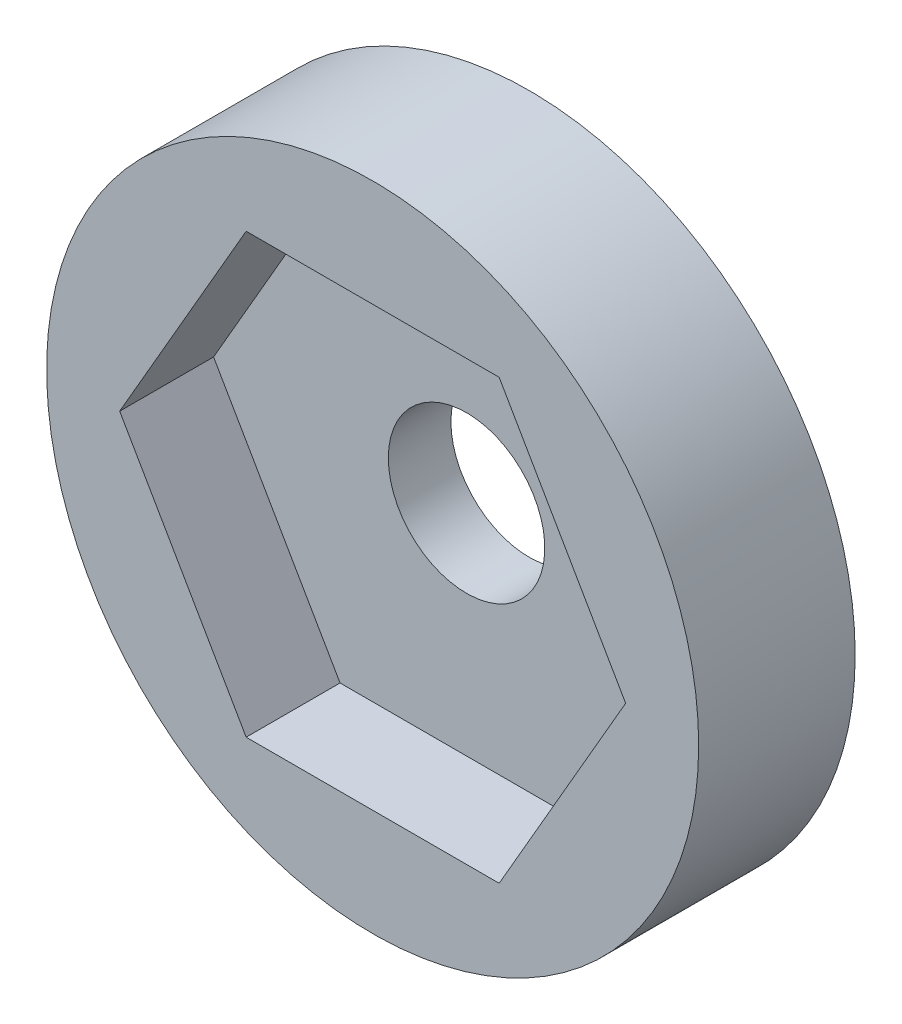
ISO-10303-21;
HEADER;
FILE_DESCRIPTION(('STEP AP214'),'2;1');
FILE_NAME('part.step','',(''),(''),'','','');
FILE_SCHEMA(('AUTOMOTIVE_DESIGN { 1 0 10303 214 1 1 1 1 }'));
ENDSEC;
DATA;
#1=APPLICATION_CONTEXT('core data for automotive mechanical design processes');
#2=APPLICATION_PROTOCOL_DEFINITION('international standard','automotive_design',2000,#1);
#3=PRODUCT_CONTEXT('',#1,'mechanical');
#4=PRODUCT('Part','Part','',(#3));
#5=PRODUCT_RELATED_PRODUCT_CATEGORY('part','',(#4));
#6=PRODUCT_DEFINITION_FORMATION('','',#4);
#7=PRODUCT_DEFINITION_CONTEXT('part definition',#1,'design');
#8=PRODUCT_DEFINITION('design','',#6,#7);
#9=PRODUCT_DEFINITION_SHAPE('','',#8);
#10=(LENGTH_UNIT() NAMED_UNIT(*) SI_UNIT(.MILLI.,.METRE.));
#11=(NAMED_UNIT(*) PLANE_ANGLE_UNIT() SI_UNIT($,.RADIAN.));
#12=(NAMED_UNIT(*) SI_UNIT($,.STERADIAN.) SOLID_ANGLE_UNIT());
#13=UNCERTAINTY_MEASURE_WITH_UNIT(LENGTH_MEASURE(1.E-05),#10,'distance_accuracy_value','');
#14=(GEOMETRIC_REPRESENTATION_CONTEXT(3) GLOBAL_UNCERTAINTY_ASSIGNED_CONTEXT((#13)) GLOBAL_UNIT_ASSIGNED_CONTEXT((#10,
#11,#12)) REPRESENTATION_CONTEXT('',''));
#15=CARTESIAN_POINT('',(0.,0.,0.));
#16=DIRECTION('',(0.,0.,1.));
#17=DIRECTION('',(1.,0.,0.));
#18=AXIS2_PLACEMENT_3D('',#15,#16,#17);
#19=CARTESIAN_POINT('',(0.,0.,6.));
#20=DIRECTION('',(0.,0.,-1.));
#21=DIRECTION('',(-1.,0.,0.));
#22=AXIS2_PLACEMENT_3D('',#19,#20,#21);
#23=CYLINDRICAL_SURFACE('',#22,12.5);
#24=CARTESIAN_POINT('',(0.,0.,6.));
#25=DIRECTION('',(0.,0.,1.));
#26=DIRECTION('',(1.,0.,0.));
#27=AXIS2_PLACEMENT_3D('',#24,#25,#26);
#28=CIRCLE('',#27,12.5);
#29=CARTESIAN_POINT('',(12.5,0.,6.));
#30=VERTEX_POINT('',#29);
#31=EDGE_CURVE('E11',#30,#30,#28,.T.);
#32=ORIENTED_EDGE('',*,*,#31,.F.);
#33=EDGE_LOOP('',(#32));
#34=FACE_BOUND('',#33,.T.);
#35=CARTESIAN_POINT('',(0.,0.,0.));
#36=DIRECTION('',(0.,0.,1.));
#37=DIRECTION('',(1.,0.,0.));
#38=AXIS2_PLACEMENT_3D('',#35,#36,#37);
#39=CIRCLE('',#38,12.5);
#40=CARTESIAN_POINT('',(12.5,0.,0.));
#41=VERTEX_POINT('',#40);
#42=EDGE_CURVE('E46',#41,#41,#39,.T.);
#43=ORIENTED_EDGE('',*,*,#42,.T.);
#44=EDGE_LOOP('',(#43));
#45=FACE_BOUND('',#44,.T.);
#46=ADVANCED_FACE('F43',(#34,#45),#23,.T.);
#47=CARTESIAN_POINT('',(0.,0.,6.));
#48=DIRECTION('',(0.,0.,1.));
#49=DIRECTION('',(1.,0.,0.));
#50=AXIS2_PLACEMENT_3D('',#47,#48,#49);
#51=PLANE('',#50);
#52=DIRECTION('',(0.5,0.866025403784439,0.));
#53=VECTOR('',#52,1.);
#54=CARTESIAN_POINT('',(4.84974226119286,-8.4,6.));
#55=LINE('',#54,#53);
#56=CARTESIAN_POINT('',(4.84974226119286,-8.4,6.));
#57=VERTEX_POINT('',#56);
#58=CARTESIAN_POINT('',(9.69948452238572,0.,6.));
#59=VERTEX_POINT('',#58);
#60=EDGE_CURVE('E58',#57,#59,#55,.T.);
#61=ORIENTED_EDGE('',*,*,#60,.F.);
#62=DIRECTION('',(1.,0.,0.));
#63=VECTOR('',#62,1.);
#64=CARTESIAN_POINT('',(-4.84974226119286,-8.4,6.));
#65=LINE('',#64,#63);
#66=CARTESIAN_POINT('',(-4.84974226119286,-8.4,6.));
#67=VERTEX_POINT('',#66);
#68=EDGE_CURVE('E152',#67,#57,#65,.T.);
#69=ORIENTED_EDGE('',*,*,#68,.F.);
#70=DIRECTION('',(0.5,-0.866025403784439,0.));
#71=VECTOR('',#70,1.);
#72=CARTESIAN_POINT('',(-9.69948452238571,0.,6.));
#73=LINE('',#72,#71);
#74=CARTESIAN_POINT('',(-9.69948452238571,0.,6.));
#75=VERTEX_POINT('',#74);
#76=EDGE_CURVE('E149',#75,#67,#73,.T.);
#77=ORIENTED_EDGE('',*,*,#76,.F.);
#78=DIRECTION('',(-0.5,-0.866025403784439,0.));
#79=VECTOR('',#78,1.);
#80=CARTESIAN_POINT('',(-4.84974226119286,8.4,6.));
#81=LINE('',#80,#79);
#82=CARTESIAN_POINT('',(-4.84974226119286,8.4,6.));
#83=VERTEX_POINT('',#82);
#84=EDGE_CURVE('E106',#83,#75,#81,.T.);
#85=ORIENTED_EDGE('',*,*,#84,.F.);
#86=DIRECTION('',(-1.,0.,0.));
#87=VECTOR('',#86,1.);
#88=CARTESIAN_POINT('',(4.84974226119286,8.4,6.));
#89=LINE('',#88,#87);
#90=CARTESIAN_POINT('',(4.84974226119286,8.4,6.));
#91=VERTEX_POINT('',#90);
#92=EDGE_CURVE('E143',#91,#83,#89,.T.);
#93=ORIENTED_EDGE('',*,*,#92,.F.);
#94=DIRECTION('',(-0.5,0.866025403784439,0.));
#95=VECTOR('',#94,1.);
#96=CARTESIAN_POINT('',(9.69948452238571,0.,6.));
#97=LINE('',#96,#95);
#98=EDGE_CURVE('E138',#59,#91,#97,.T.);
#99=ORIENTED_EDGE('',*,*,#98,.F.);
#100=EDGE_LOOP('',(#61,#69,#77,#85,#93,#99));
#101=FACE_BOUND('',#100,.T.);
#102=ORIENTED_EDGE('',*,*,#31,.T.);
#103=EDGE_LOOP('',(#102));
#104=FACE_BOUND('',#103,.T.);
#105=ADVANCED_FACE('F171',(#101,#104),#51,.T.);
#106=CARTESIAN_POINT('',(0.,0.,0.));
#107=DIRECTION('',(0.,0.,1.));
#108=DIRECTION('',(1.,0.,0.));
#109=AXIS2_PLACEMENT_3D('',#106,#107,#108);
#110=PLANE('',#109);
#111=CARTESIAN_POINT('',(0.,0.,0.));
#112=DIRECTION('',(0.,0.,-1.));
#113=DIRECTION('',(-1.,0.,0.));
#114=AXIS2_PLACEMENT_3D('',#111,#112,#113);
#115=CIRCLE('',#114,3.);
#116=CARTESIAN_POINT('',(-3.,0.,0.));
#117=VERTEX_POINT('',#116);
#118=EDGE_CURVE('E180',#117,#117,#115,.T.);
#119=ORIENTED_EDGE('',*,*,#118,.F.);
#120=EDGE_LOOP('',(#119));
#121=FACE_BOUND('',#120,.T.);
#122=ORIENTED_EDGE('',*,*,#42,.F.);
#123=EDGE_LOOP('',(#122));
#124=FACE_BOUND('',#123,.T.);
#125=ADVANCED_FACE('F195',(#121,#124),#110,.F.);
#126=CARTESIAN_POINT('',(4.84974226119286,-8.4,2.4));
#127=DIRECTION('',(0.866025403784439,-0.5,0.));
#128=DIRECTION('',(0.5,0.866025403784439,0.));
#129=AXIS2_PLACEMENT_3D('',#126,#127,#128);
#130=PLANE('',#129);
#131=ORIENTED_EDGE('',*,*,#60,.T.);
#132=DIRECTION('',(0.,0.,1.));
#133=VECTOR('',#132,1.);
#134=CARTESIAN_POINT('',(9.69948452238571,0.,2.4));
#135=LINE('',#134,#133);
#136=CARTESIAN_POINT('',(9.69948452238571,0.,2.4));
#137=VERTEX_POINT('',#136);
#138=EDGE_CURVE('E88',#137,#59,#135,.T.);
#139=ORIENTED_EDGE('',*,*,#138,.F.);
#140=DIRECTION('',(0.5,0.866025403784439,0.));
#141=VECTOR('',#140,1.);
#142=CARTESIAN_POINT('',(4.84974226119286,-8.4,2.4));
#143=LINE('',#142,#141);
#144=CARTESIAN_POINT('',(4.84974226119286,-8.4,2.4));
#145=VERTEX_POINT('',#144);
#146=EDGE_CURVE('E155',#145,#137,#143,.T.);
#147=ORIENTED_EDGE('',*,*,#146,.F.);
#148=DIRECTION('',(0.,0.,1.));
#149=VECTOR('',#148,1.);
#150=CARTESIAN_POINT('',(4.84974226119286,-8.4,2.4));
#151=LINE('',#150,#149);
#152=EDGE_CURVE('E66',#145,#57,#151,.T.);
#153=ORIENTED_EDGE('',*,*,#152,.T.);
#154=EDGE_LOOP('',(#131,#139,#147,#153));
#155=FACE_BOUND('',#154,.T.);
#156=ADVANCED_FACE('F198',(#155),#130,.F.);
#157=CARTESIAN_POINT('',(-4.84974226119286,-8.4,2.4));
#158=DIRECTION('',(0.,-1.,0.));
#159=DIRECTION('',(0.,0.,-1.));
#160=AXIS2_PLACEMENT_3D('',#157,#158,#159);
#161=PLANE('',#160);
#162=ORIENTED_EDGE('',*,*,#68,.T.);
#163=ORIENTED_EDGE('',*,*,#152,.F.);
#164=DIRECTION('',(1.,0.,0.));
#165=VECTOR('',#164,1.);
#166=CARTESIAN_POINT('',(-4.84974226119286,-8.4,2.4));
#167=LINE('',#166,#165);
#168=CARTESIAN_POINT('',(-4.84974226119286,-8.4,2.4));
#169=VERTEX_POINT('',#168);
#170=EDGE_CURVE('E120',#169,#145,#167,.T.);
#171=ORIENTED_EDGE('',*,*,#170,.F.);
#172=DIRECTION('',(0.,0.,1.));
#173=VECTOR('',#172,1.);
#174=CARTESIAN_POINT('',(-4.84974226119286,-8.4,2.4));
#175=LINE('',#174,#173);
#176=EDGE_CURVE('E111',#169,#67,#175,.T.);
#177=ORIENTED_EDGE('',*,*,#176,.T.);
#178=EDGE_LOOP('',(#162,#163,#171,#177));
#179=FACE_BOUND('',#178,.T.);
#180=ADVANCED_FACE('F215',(#179),#161,.F.);
#181=CARTESIAN_POINT('',(-9.69948452238571,0.,2.4));
#182=DIRECTION('',(-0.866025403784438,-0.5,0.));
#183=DIRECTION('',(0.5,-0.866025403784439,0.));
#184=AXIS2_PLACEMENT_3D('',#181,#182,#183);
#185=PLANE('',#184);
#186=ORIENTED_EDGE('',*,*,#76,.T.);
#187=ORIENTED_EDGE('',*,*,#176,.F.);
#188=DIRECTION('',(0.5,-0.866025403784439,0.));
#189=VECTOR('',#188,1.);
#190=CARTESIAN_POINT('',(-9.69948452238571,0.,2.4));
#191=LINE('',#190,#189);
#192=CARTESIAN_POINT('',(-9.69948452238571,0.,2.4));
#193=VERTEX_POINT('',#192);
#194=EDGE_CURVE('E115',#193,#169,#191,.T.);
#195=ORIENTED_EDGE('',*,*,#194,.F.);
#196=DIRECTION('',(0.,0.,1.));
#197=VECTOR('',#196,1.);
#198=CARTESIAN_POINT('',(-9.69948452238571,0.,2.4));
#199=LINE('',#198,#197);
#200=EDGE_CURVE('E99',#193,#75,#199,.T.);
#201=ORIENTED_EDGE('',*,*,#200,.T.);
#202=EDGE_LOOP('',(#186,#187,#195,#201));
#203=FACE_BOUND('',#202,.T.);
#204=ADVANCED_FACE('F116',(#203),#185,.F.);
#205=CARTESIAN_POINT('',(-4.84974226119286,8.4,2.4));
#206=DIRECTION('',(-0.866025403784439,0.5,0.));
#207=DIRECTION('',(-0.5,-0.866025403784439,0.));
#208=AXIS2_PLACEMENT_3D('',#205,#206,#207);
#209=PLANE('',#208);
#210=ORIENTED_EDGE('',*,*,#84,.T.);
#211=ORIENTED_EDGE('',*,*,#200,.F.);
#212=DIRECTION('',(-0.5,-0.866025403784439,0.));
#213=VECTOR('',#212,1.);
#214=CARTESIAN_POINT('',(-4.84974226119286,8.4,2.4));
#215=LINE('',#214,#213);
#216=CARTESIAN_POINT('',(-4.84974226119286,8.4,2.4));
#217=VERTEX_POINT('',#216);
#218=EDGE_CURVE('E103',#217,#193,#215,.T.);
#219=ORIENTED_EDGE('',*,*,#218,.F.);
#220=DIRECTION('',(0.,0.,1.));
#221=VECTOR('',#220,1.);
#222=CARTESIAN_POINT('',(-4.84974226119286,8.4,2.4));
#223=LINE('',#222,#221);
#224=EDGE_CURVE('E112',#217,#83,#223,.T.);
#225=ORIENTED_EDGE('',*,*,#224,.T.);
#226=EDGE_LOOP('',(#210,#211,#219,#225));
#227=FACE_BOUND('',#226,.T.);
#228=ADVANCED_FACE('F101',(#227),#209,.F.);
#229=CARTESIAN_POINT('',(4.84974226119286,8.4,2.4));
#230=DIRECTION('',(0.,1.,0.));
#231=DIRECTION('',(0.,0.,1.));
#232=AXIS2_PLACEMENT_3D('',#229,#230,#231);
#233=PLANE('',#232);
#234=ORIENTED_EDGE('',*,*,#92,.T.);
#235=ORIENTED_EDGE('',*,*,#224,.F.);
#236=DIRECTION('',(-1.,0.,0.));
#237=VECTOR('',#236,1.);
#238=CARTESIAN_POINT('',(4.84974226119286,8.4,2.4));
#239=LINE('',#238,#237);
#240=CARTESIAN_POINT('',(4.84974226119286,8.4,2.4));
#241=VERTEX_POINT('',#240);
#242=EDGE_CURVE('E126',#241,#217,#239,.T.);
#243=ORIENTED_EDGE('',*,*,#242,.F.);
#244=DIRECTION('',(0.,0.,1.));
#245=VECTOR('',#244,1.);
#246=CARTESIAN_POINT('',(4.84974226119286,8.4,2.4));
#247=LINE('',#246,#245);
#248=EDGE_CURVE('E162',#241,#91,#247,.T.);
#249=ORIENTED_EDGE('',*,*,#248,.T.);
#250=EDGE_LOOP('',(#234,#235,#243,#249));
#251=FACE_BOUND('',#250,.T.);
#252=ADVANCED_FACE('F175',(#251),#233,.F.);
#253=CARTESIAN_POINT('',(9.69948452238571,0.,2.4));
#254=DIRECTION('',(0.866025403784438,0.5,0.));
#255=DIRECTION('',(-0.5,0.866025403784439,0.));
#256=AXIS2_PLACEMENT_3D('',#253,#254,#255);
#257=PLANE('',#256);
#258=ORIENTED_EDGE('',*,*,#98,.T.);
#259=ORIENTED_EDGE('',*,*,#248,.F.);
#260=DIRECTION('',(-0.5,0.866025403784439,0.));
#261=VECTOR('',#260,1.);
#262=CARTESIAN_POINT('',(9.69948452238571,0.,2.4));
#263=LINE('',#262,#261);
#264=EDGE_CURVE('E130',#137,#241,#263,.T.);
#265=ORIENTED_EDGE('',*,*,#264,.F.);
#266=ORIENTED_EDGE('',*,*,#138,.T.);
#267=EDGE_LOOP('',(#258,#259,#265,#266));
#268=FACE_BOUND('',#267,.T.);
#269=ADVANCED_FACE('F168',(#268),#257,.F.);
#270=CARTESIAN_POINT('',(0.,0.,2.4));
#271=DIRECTION('',(0.,0.,1.));
#272=DIRECTION('',(1.,0.,0.));
#273=AXIS2_PLACEMENT_3D('',#270,#271,#272);
#274=PLANE('',#273);
#275=CARTESIAN_POINT('',(0.,0.,2.4));
#276=DIRECTION('',(0.,0.,-1.));
#277=DIRECTION('',(-1.,0.,0.));
#278=AXIS2_PLACEMENT_3D('',#275,#276,#277);
#279=CIRCLE('',#278,3.);
#280=CARTESIAN_POINT('',(-3.,0.,2.4));
#281=VERTEX_POINT('',#280);
#282=EDGE_CURVE('E139',#281,#281,#279,.T.);
#283=ORIENTED_EDGE('',*,*,#282,.T.);
#284=EDGE_LOOP('',(#283));
#285=FACE_BOUND('',#284,.T.);
#286=ORIENTED_EDGE('',*,*,#146,.T.);
#287=ORIENTED_EDGE('',*,*,#264,.T.);
#288=ORIENTED_EDGE('',*,*,#242,.T.);
#289=ORIENTED_EDGE('',*,*,#218,.T.);
#290=ORIENTED_EDGE('',*,*,#194,.T.);
#291=ORIENTED_EDGE('',*,*,#170,.T.);
#292=EDGE_LOOP('',(#286,#287,#288,#289,#290,#291));
#293=FACE_BOUND('',#292,.T.);
#294=ADVANCED_FACE('F123',(#285,#293),#274,.T.);
#295=CARTESIAN_POINT('',(0.,0.,2.4));
#296=DIRECTION('',(0.,0.,-1.));
#297=DIRECTION('',(-1.,0.,0.));
#298=AXIS2_PLACEMENT_3D('',#295,#296,#297);
#299=CYLINDRICAL_SURFACE('',#298,3.);
#300=ORIENTED_EDGE('',*,*,#282,.F.);
#301=EDGE_LOOP('',(#300));
#302=FACE_BOUND('',#301,.T.);
#303=ORIENTED_EDGE('',*,*,#118,.T.);
#304=EDGE_LOOP('',(#303));
#305=FACE_BOUND('',#304,.T.);
#306=ADVANCED_FACE('F189',(#302,#305),#299,.F.);
#307=CLOSED_SHELL('',(#46,#105,#125,#156,#180,#204,#228,#252,#269,#294,#306));
#308=MANIFOLD_SOLID_BREP('B2',#307);
#309=ADVANCED_BREP_SHAPE_REPRESENTATION('',(#18,#308),#14);
#310=SHAPE_DEFINITION_REPRESENTATION(#9,#309);
ENDSEC;
END-ISO-10303-21;
